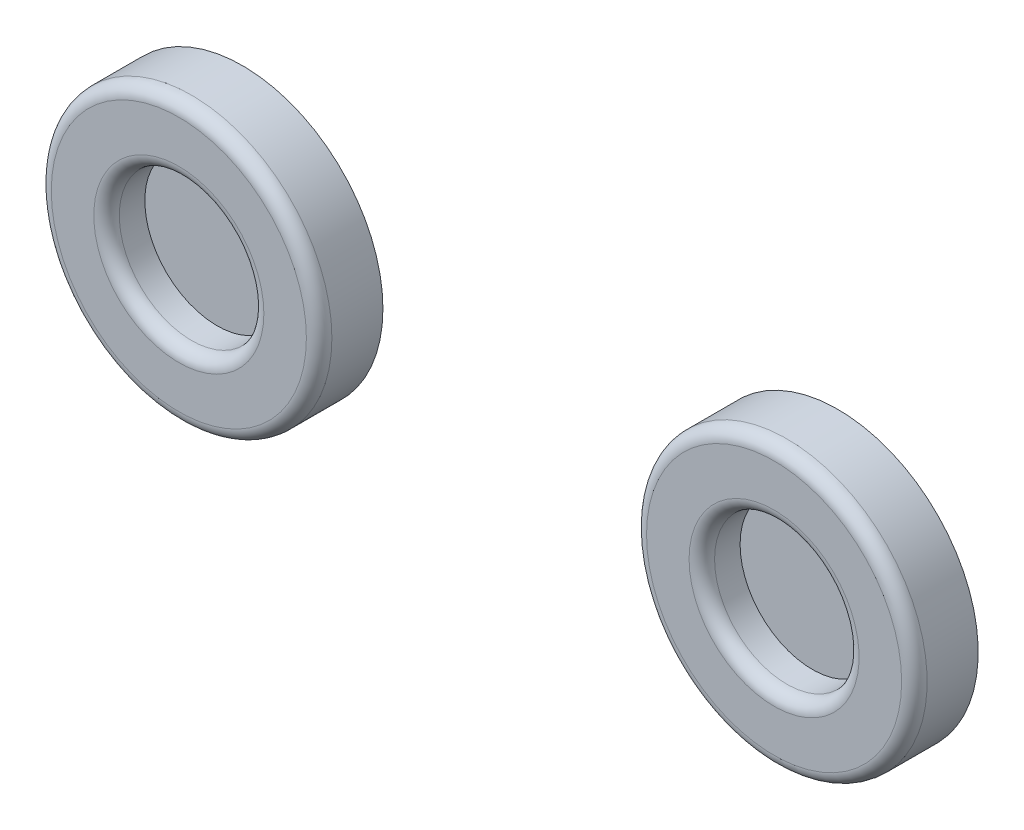
ISO-10303-21;
HEADER;
FILE_DESCRIPTION(('STEP AP214'),'2;1');
FILE_NAME('part.step','',(''),(''),'','','');
FILE_SCHEMA(('AUTOMOTIVE_DESIGN { 1 0 10303 214 1 1 1 1 }'));
ENDSEC;
DATA;
#1=APPLICATION_CONTEXT('core data for automotive mechanical design processes');
#2=APPLICATION_PROTOCOL_DEFINITION('international standard','automotive_design',2000,#1);
#3=PRODUCT_CONTEXT('',#1,'mechanical');
#4=PRODUCT('Part','Part','',(#3));
#5=PRODUCT_RELATED_PRODUCT_CATEGORY('part','',(#4));
#6=PRODUCT_DEFINITION_FORMATION('','',#4);
#7=PRODUCT_DEFINITION_CONTEXT('part definition',#1,'design');
#8=PRODUCT_DEFINITION('design','',#6,#7);
#9=PRODUCT_DEFINITION_SHAPE('','',#8);
#10=(LENGTH_UNIT() NAMED_UNIT(*) SI_UNIT(.MILLI.,.METRE.));
#11=(NAMED_UNIT(*) PLANE_ANGLE_UNIT() SI_UNIT($,.RADIAN.));
#12=(NAMED_UNIT(*) SI_UNIT($,.STERADIAN.) SOLID_ANGLE_UNIT());
#13=UNCERTAINTY_MEASURE_WITH_UNIT(LENGTH_MEASURE(1.E-05),#10,'distance_accuracy_value','');
#14=(GEOMETRIC_REPRESENTATION_CONTEXT(3) GLOBAL_UNCERTAINTY_ASSIGNED_CONTEXT((#13)) GLOBAL_UNIT_ASSIGNED_CONTEXT((#10,
#11,#12)) REPRESENTATION_CONTEXT('',''));
#15=CARTESIAN_POINT('',(0.,0.,0.));
#16=DIRECTION('',(0.,0.,1.));
#17=DIRECTION('',(1.,0.,0.));
#18=AXIS2_PLACEMENT_3D('',#15,#16,#17);
#19=CARTESIAN_POINT('',(70.,0.,15.));
#20=DIRECTION('',(0.,0.,-1.));
#21=DIRECTION('',(-1.,0.,0.));
#22=AXIS2_PLACEMENT_3D('',#19,#20,#21);
#23=CYLINDRICAL_SURFACE('',#22,33.);
#24=CARTESIAN_POINT('',(70.,0.,12.));
#25=DIRECTION('',(0.,0.,-1.));
#26=DIRECTION('',(-1.,0.,0.));
#27=AXIS2_PLACEMENT_3D('',#24,#25,#26);
#28=CIRCLE('',#27,33.);
#29=CARTESIAN_POINT('',(37.,0.,12.));
#30=VERTEX_POINT('',#29);
#31=EDGE_CURVE('E54',#30,#30,#28,.T.);
#32=ORIENTED_EDGE('',*,*,#31,.T.);
#33=EDGE_LOOP('',(#32));
#34=FACE_BOUND('',#33,.T.);
#35=CARTESIAN_POINT('',(70.,0.,0.));
#36=DIRECTION('',(0.,0.,1.));
#37=DIRECTION('',(-1.,0.,0.));
#38=AXIS2_PLACEMENT_3D('',#35,#36,#37);
#39=CIRCLE('',#38,33.);
#40=CARTESIAN_POINT('',(37.,0.,0.));
#41=VERTEX_POINT('',#40);
#42=EDGE_CURVE('E63',#41,#41,#39,.T.);
#43=ORIENTED_EDGE('',*,*,#42,.T.);
#44=EDGE_LOOP('',(#43));
#45=FACE_BOUND('',#44,.T.);
#46=ADVANCED_FACE('F43',(#34,#45),#23,.T.);
#47=CARTESIAN_POINT('',(70.,0.,15.));
#48=DIRECTION('',(0.,0.,-1.));
#49=DIRECTION('',(-1.,0.,0.));
#50=AXIS2_PLACEMENT_3D('',#47,#48,#49);
#51=PLANE('',#50);
#52=CARTESIAN_POINT('',(70.,0.,15.));
#53=DIRECTION('',(0.,0.,-1.));
#54=DIRECTION('',(-1.,0.,0.));
#55=AXIS2_PLACEMENT_3D('',#52,#53,#54);
#56=CIRCLE('',#55,20.);
#57=CARTESIAN_POINT('',(50.,0.,15.));
#58=VERTEX_POINT('',#57);
#59=EDGE_CURVE('E11',#58,#58,#56,.T.);
#60=ORIENTED_EDGE('',*,*,#59,.T.);
#61=EDGE_LOOP('',(#60));
#62=FACE_BOUND('',#61,.T.);
#63=CARTESIAN_POINT('',(70.,0.,15.));
#64=DIRECTION('',(0.,0.,-1.));
#65=DIRECTION('',(-1.,0.,0.));
#66=AXIS2_PLACEMENT_3D('',#63,#64,#65);
#67=CIRCLE('',#66,30.);
#68=CARTESIAN_POINT('',(40.,0.,15.));
#69=VERTEX_POINT('',#68);
#70=EDGE_CURVE('E58',#69,#69,#67,.F.);
#71=ORIENTED_EDGE('',*,*,#70,.T.);
#72=EDGE_LOOP('',(#71));
#73=FACE_BOUND('',#72,.T.);
#74=ADVANCED_FACE('F82',(#62,#73),#51,.F.);
#75=CARTESIAN_POINT('',(70.,0.,0.));
#76=DIRECTION('',(0.,0.,-1.));
#77=DIRECTION('',(-1.,0.,0.));
#78=AXIS2_PLACEMENT_3D('',#75,#76,#77);
#79=PLANE('',#78);
#80=ORIENTED_EDGE('',*,*,#42,.F.);
#81=EDGE_LOOP('',(#80));
#82=FACE_BOUND('',#81,.T.);
#83=ADVANCED_FACE('F74',(#82),#79,.T.);
#84=CARTESIAN_POINT('',(70.,0.,6.));
#85=DIRECTION('',(0.,0.,1.));
#86=DIRECTION('',(1.,0.,0.));
#87=AXIS2_PLACEMENT_3D('',#84,#85,#86);
#88=CYLINDRICAL_SURFACE('',#87,17.);
#89=CARTESIAN_POINT('',(70.,0.,12.));
#90=DIRECTION('',(0.,0.,-1.));
#91=DIRECTION('',(-1.,0.,0.));
#92=AXIS2_PLACEMENT_3D('',#89,#90,#91);
#93=CIRCLE('',#92,17.);
#94=CARTESIAN_POINT('',(53.,0.,12.));
#95=VERTEX_POINT('',#94);
#96=EDGE_CURVE('E50',#95,#95,#93,.F.);
#97=ORIENTED_EDGE('',*,*,#96,.T.);
#98=EDGE_LOOP('',(#97));
#99=FACE_BOUND('',#98,.T.);
#100=CARTESIAN_POINT('',(70.,0.,6.));
#101=DIRECTION('',(0.,0.,1.));
#102=DIRECTION('',(-1.,0.,0.));
#103=AXIS2_PLACEMENT_3D('',#100,#101,#102);
#104=CIRCLE('',#103,17.);
#105=CARTESIAN_POINT('',(53.,0.,6.));
#106=VERTEX_POINT('',#105);
#107=EDGE_CURVE('E66',#106,#106,#104,.T.);
#108=ORIENTED_EDGE('',*,*,#107,.F.);
#109=EDGE_LOOP('',(#108));
#110=FACE_BOUND('',#109,.T.);
#111=ADVANCED_FACE('F72',(#99,#110),#88,.F.);
#112=CARTESIAN_POINT('',(70.,0.,6.));
#113=DIRECTION('',(0.,0.,-1.));
#114=DIRECTION('',(-1.,0.,0.));
#115=AXIS2_PLACEMENT_3D('',#112,#113,#114);
#116=PLANE('',#115);
#117=ORIENTED_EDGE('',*,*,#107,.T.);
#118=EDGE_LOOP('',(#117));
#119=FACE_BOUND('',#118,.T.);
#120=ADVANCED_FACE('F70',(#119),#116,.F.);
#121=CARTESIAN_POINT('',(70.,0.,12.));
#122=DIRECTION('',(0.,0.,-1.));
#123=DIRECTION('',(-1.,0.,0.));
#124=AXIS2_PLACEMENT_3D('',#121,#122,#123);
#125=TOROIDAL_SURFACE('',#124,30.,3.);
#126=ORIENTED_EDGE('',*,*,#31,.F.);
#127=EDGE_LOOP('',(#126));
#128=FACE_BOUND('',#127,.T.);
#129=ORIENTED_EDGE('',*,*,#70,.F.);
#130=EDGE_LOOP('',(#129));
#131=FACE_BOUND('',#130,.T.);
#132=ADVANCED_FACE('F80',(#128,#131),#125,.T.);
#133=CARTESIAN_POINT('',(70.,0.,12.));
#134=DIRECTION('',(0.,0.,-1.));
#135=DIRECTION('',(-1.,0.,0.));
#136=AXIS2_PLACEMENT_3D('',#133,#134,#135);
#137=TOROIDAL_SURFACE('',#136,20.,3.);
#138=ORIENTED_EDGE('',*,*,#59,.F.);
#139=EDGE_LOOP('',(#138));
#140=FACE_BOUND('',#139,.T.);
#141=ORIENTED_EDGE('',*,*,#96,.F.);
#142=EDGE_LOOP('',(#141));
#143=FACE_BOUND('',#142,.T.);
#144=ADVANCED_FACE('F45',(#140,#143),#137,.T.);
#145=CLOSED_SHELL('',(#46,#74,#83,#111,#120,#132,#144));
#146=MANIFOLD_SOLID_BREP('B2',#145);
#147=CARTESIAN_POINT('',(-70.,0.,15.));
#148=DIRECTION('',(0.,0.,-1.));
#149=DIRECTION('',(-1.,0.,0.));
#150=AXIS2_PLACEMENT_3D('',#147,#148,#149);
#151=CYLINDRICAL_SURFACE('',#150,33.);
#152=CARTESIAN_POINT('',(-70.,0.,12.));
#153=DIRECTION('',(0.,0.,1.));
#154=DIRECTION('',(1.,0.,0.));
#155=AXIS2_PLACEMENT_3D('',#152,#153,#154);
#156=CIRCLE('',#155,33.);
#157=CARTESIAN_POINT('',(-37.,0.,12.));
#158=VERTEX_POINT('',#157);
#159=EDGE_CURVE('E155',#158,#158,#156,.F.);
#160=ORIENTED_EDGE('',*,*,#159,.T.);
#161=EDGE_LOOP('',(#160));
#162=FACE_BOUND('',#161,.T.);
#163=CARTESIAN_POINT('',(-70.,0.,0.));
#164=DIRECTION('',(0.,0.,1.));
#165=DIRECTION('',(1.,0.,0.));
#166=AXIS2_PLACEMENT_3D('',#163,#164,#165);
#167=CIRCLE('',#166,33.);
#168=CARTESIAN_POINT('',(-37.,0.,0.));
#169=VERTEX_POINT('',#168);
#170=EDGE_CURVE('E164',#169,#169,#167,.T.);
#171=ORIENTED_EDGE('',*,*,#170,.T.);
#172=EDGE_LOOP('',(#171));
#173=FACE_BOUND('',#172,.T.);
#174=ADVANCED_FACE('F144',(#162,#173),#151,.T.);
#175=CARTESIAN_POINT('',(-70.,0.,15.));
#176=DIRECTION('',(0.,0.,1.));
#177=DIRECTION('',(1.,0.,0.));
#178=AXIS2_PLACEMENT_3D('',#175,#176,#177);
#179=PLANE('',#178);
#180=CARTESIAN_POINT('',(-70.,0.,15.));
#181=DIRECTION('',(0.,0.,1.));
#182=DIRECTION('',(1.,0.,0.));
#183=AXIS2_PLACEMENT_3D('',#180,#181,#182);
#184=CIRCLE('',#183,20.);
#185=CARTESIAN_POINT('',(-50.,0.,15.));
#186=VERTEX_POINT('',#185);
#187=EDGE_CURVE('E42',#186,#186,#184,.F.);
#188=ORIENTED_EDGE('',*,*,#187,.T.);
#189=EDGE_LOOP('',(#188));
#190=FACE_BOUND('',#189,.T.);
#191=CARTESIAN_POINT('',(-70.,0.,15.));
#192=DIRECTION('',(0.,0.,1.));
#193=DIRECTION('',(1.,0.,0.));
#194=AXIS2_PLACEMENT_3D('',#191,#192,#193);
#195=CIRCLE('',#194,30.);
#196=CARTESIAN_POINT('',(-40.,0.,15.));
#197=VERTEX_POINT('',#196);
#198=EDGE_CURVE('E159',#197,#197,#195,.T.);
#199=ORIENTED_EDGE('',*,*,#198,.T.);
#200=EDGE_LOOP('',(#199));
#201=FACE_BOUND('',#200,.T.);
#202=ADVANCED_FACE('F183',(#190,#201),#179,.T.);
#203=CARTESIAN_POINT('',(-70.,0.,0.));
#204=DIRECTION('',(0.,0.,1.));
#205=DIRECTION('',(1.,0.,0.));
#206=AXIS2_PLACEMENT_3D('',#203,#204,#205);
#207=PLANE('',#206);
#208=ORIENTED_EDGE('',*,*,#170,.F.);
#209=EDGE_LOOP('',(#208));
#210=FACE_BOUND('',#209,.T.);
#211=ADVANCED_FACE('F175',(#210),#207,.F.);
#212=CARTESIAN_POINT('',(-70.,0.,6.));
#213=DIRECTION('',(0.,0.,1.));
#214=DIRECTION('',(1.,0.,0.));
#215=AXIS2_PLACEMENT_3D('',#212,#213,#214);
#216=CYLINDRICAL_SURFACE('',#215,17.);
#217=CARTESIAN_POINT('',(-70.,0.,12.));
#218=DIRECTION('',(0.,0.,1.));
#219=DIRECTION('',(1.,0.,0.));
#220=AXIS2_PLACEMENT_3D('',#217,#218,#219);
#221=CIRCLE('',#220,17.);
#222=CARTESIAN_POINT('',(-53.,0.,12.));
#223=VERTEX_POINT('',#222);
#224=EDGE_CURVE('E151',#223,#223,#221,.T.);
#225=ORIENTED_EDGE('',*,*,#224,.T.);
#226=EDGE_LOOP('',(#225));
#227=FACE_BOUND('',#226,.T.);
#228=CARTESIAN_POINT('',(-70.,0.,6.));
#229=DIRECTION('',(0.,0.,1.));
#230=DIRECTION('',(1.,0.,0.));
#231=AXIS2_PLACEMENT_3D('',#228,#229,#230);
#232=CIRCLE('',#231,17.);
#233=CARTESIAN_POINT('',(-53.,0.,6.));
#234=VERTEX_POINT('',#233);
#235=EDGE_CURVE('E167',#234,#234,#232,.T.);
#236=ORIENTED_EDGE('',*,*,#235,.F.);
#237=EDGE_LOOP('',(#236));
#238=FACE_BOUND('',#237,.T.);
#239=ADVANCED_FACE('F173',(#227,#238),#216,.F.);
#240=CARTESIAN_POINT('',(-70.,0.,6.));
#241=DIRECTION('',(0.,0.,1.));
#242=DIRECTION('',(1.,0.,0.));
#243=AXIS2_PLACEMENT_3D('',#240,#241,#242);
#244=PLANE('',#243);
#245=ORIENTED_EDGE('',*,*,#235,.T.);
#246=EDGE_LOOP('',(#245));
#247=FACE_BOUND('',#246,.T.);
#248=ADVANCED_FACE('F171',(#247),#244,.T.);
#249=CARTESIAN_POINT('',(-70.,0.,12.));
#250=DIRECTION('',(0.,0.,1.));
#251=DIRECTION('',(1.,0.,0.));
#252=AXIS2_PLACEMENT_3D('',#249,#250,#251);
#253=TOROIDAL_SURFACE('',#252,30.,3.);
#254=ORIENTED_EDGE('',*,*,#159,.F.);
#255=EDGE_LOOP('',(#254));
#256=FACE_BOUND('',#255,.T.);
#257=ORIENTED_EDGE('',*,*,#198,.F.);
#258=EDGE_LOOP('',(#257));
#259=FACE_BOUND('',#258,.T.);
#260=ADVANCED_FACE('F181',(#256,#259),#253,.T.);
#261=CARTESIAN_POINT('',(-70.,0.,12.));
#262=DIRECTION('',(0.,0.,1.));
#263=DIRECTION('',(1.,0.,0.));
#264=AXIS2_PLACEMENT_3D('',#261,#262,#263);
#265=TOROIDAL_SURFACE('',#264,20.,3.);
#266=ORIENTED_EDGE('',*,*,#187,.F.);
#267=EDGE_LOOP('',(#266));
#268=FACE_BOUND('',#267,.T.);
#269=ORIENTED_EDGE('',*,*,#224,.F.);
#270=EDGE_LOOP('',(#269));
#271=FACE_BOUND('',#270,.T.);
#272=ADVANCED_FACE('F146',(#268,#271),#265,.T.);
#273=CLOSED_SHELL('',(#174,#202,#211,#239,#248,#260,#272));
#274=MANIFOLD_SOLID_BREP('B6',#273);
#275=ADVANCED_BREP_SHAPE_REPRESENTATION('',(#18,#146,#274),#14);
#276=SHAPE_DEFINITION_REPRESENTATION(#9,#275);
ENDSEC;
END-ISO-10303-21;
